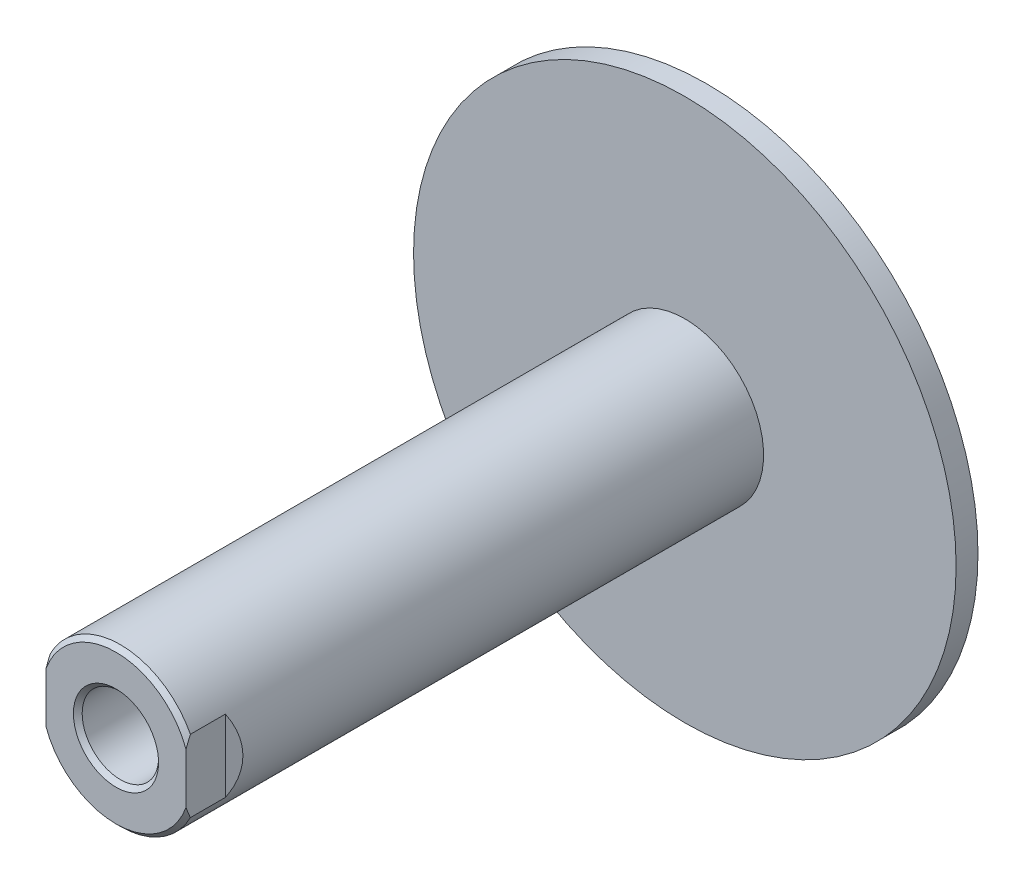
ISO-10303-21;
HEADER;
FILE_DESCRIPTION(('STEP AP214'),'2;1');
FILE_NAME('part.step','',(''),(''),'','','');
FILE_SCHEMA(('AUTOMOTIVE_DESIGN { 1 0 10303 214 1 1 1 1 }'));
ENDSEC;
DATA;
#1=APPLICATION_CONTEXT('core data for automotive mechanical design processes');
#2=APPLICATION_PROTOCOL_DEFINITION('international standard','automotive_design',2000,#1);
#3=PRODUCT_CONTEXT('',#1,'mechanical');
#4=PRODUCT('Part','Part','',(#3));
#5=PRODUCT_RELATED_PRODUCT_CATEGORY('part','',(#4));
#6=PRODUCT_DEFINITION_FORMATION('','',#4);
#7=PRODUCT_DEFINITION_CONTEXT('part definition',#1,'design');
#8=PRODUCT_DEFINITION('design','',#6,#7);
#9=PRODUCT_DEFINITION_SHAPE('','',#8);
#10=(LENGTH_UNIT() NAMED_UNIT(*) SI_UNIT(.MILLI.,.METRE.));
#11=(NAMED_UNIT(*) PLANE_ANGLE_UNIT() SI_UNIT($,.RADIAN.));
#12=(NAMED_UNIT(*) SI_UNIT($,.STERADIAN.) SOLID_ANGLE_UNIT());
#13=UNCERTAINTY_MEASURE_WITH_UNIT(LENGTH_MEASURE(1.E-05),#10,'distance_accuracy_value','');
#14=(GEOMETRIC_REPRESENTATION_CONTEXT(3) GLOBAL_UNCERTAINTY_ASSIGNED_CONTEXT((#13)) GLOBAL_UNIT_ASSIGNED_CONTEXT((#10,
#11,#12)) REPRESENTATION_CONTEXT('',''));
#15=CARTESIAN_POINT('',(0.,0.,0.));
#16=DIRECTION('',(0.,0.,1.));
#17=DIRECTION('',(1.,0.,0.));
#18=AXIS2_PLACEMENT_3D('',#15,#16,#17);
#19=CARTESIAN_POINT('',(0.,0.,5.));
#20=DIRECTION('',(0.,0.,-1.));
#21=DIRECTION('',(-1.,0.,0.));
#22=AXIS2_PLACEMENT_3D('',#19,#20,#21);
#23=CYLINDRICAL_SURFACE('',#22,18.);
#24=CARTESIAN_POINT('',(0.,0.,134.));
#25=DIRECTION('',(0.,0.,-1.));
#26=DIRECTION('',(-1.,0.,0.));
#27=AXIS2_PLACEMENT_3D('',#24,#25,#26);
#28=CIRCLE('',#27,18.);
#29=CARTESIAN_POINT('',(16.,-8.24621125123532,134.));
#30=VERTEX_POINT('',#29);
#31=CARTESIAN_POINT('',(-16.,-8.24621125123534,134.));
#32=VERTEX_POINT('',#31);
#33=EDGE_CURVE('E136',#30,#32,#28,.T.);
#34=ORIENTED_EDGE('',*,*,#33,.T.);
#35=DIRECTION('',(0.,0.,-1.));
#36=VECTOR('',#35,1.);
#37=CARTESIAN_POINT('',(-16.,-8.24621125123532,5.));
#38=LINE('',#37,#36);
#39=CARTESIAN_POINT('',(-16.,-8.24621125123532,126.));
#40=VERTEX_POINT('',#39);
#41=EDGE_CURVE('E120',#32,#40,#38,.T.);
#42=ORIENTED_EDGE('',*,*,#41,.T.);
#43=CARTESIAN_POINT('',(0.,0.,142.));
#44=DIRECTION('',(-0.707106781186552,0.,0.707106781186543));
#45=DIRECTION('',(-0.707106781186543,0.,-0.707106781186552));
#46=AXIS2_PLACEMENT_3D('',#43,#44,#45);
#47=ELLIPSE('',#46,25.4558441227159,18.);
#48=CARTESIAN_POINT('',(-18.,0.,124.));
#49=VERTEX_POINT('',#48);
#50=EDGE_CURVE('E48',#40,#49,#47,.F.);
#51=ORIENTED_EDGE('',*,*,#50,.T.);
#52=CARTESIAN_POINT('',(0.,0.,142.));
#53=DIRECTION('',(-0.707106781186552,0.,0.707106781186543));
#54=DIRECTION('',(-0.707106781186543,0.,-0.707106781186552));
#55=AXIS2_PLACEMENT_3D('',#52,#53,#54);
#56=ELLIPSE('',#55,25.4558441227159,18.);
#57=CARTESIAN_POINT('',(-16.,8.24621125123532,126.));
#58=VERTEX_POINT('',#57);
#59=EDGE_CURVE('E201',#49,#58,#56,.F.);
#60=ORIENTED_EDGE('',*,*,#59,.T.);
#61=DIRECTION('',(0.,0.,-1.));
#62=VECTOR('',#61,1.);
#63=CARTESIAN_POINT('',(-16.,8.24621125123532,5.));
#64=LINE('',#63,#62);
#65=CARTESIAN_POINT('',(-16.,8.24621125123532,134.));
#66=VERTEX_POINT('',#65);
#67=EDGE_CURVE('E118',#58,#66,#64,.F.);
#68=ORIENTED_EDGE('',*,*,#67,.T.);
#69=CARTESIAN_POINT('',(16.,8.24621125123534,134.));
#70=VERTEX_POINT('',#69);
#71=EDGE_CURVE('E133',#66,#70,#28,.T.);
#72=ORIENTED_EDGE('',*,*,#71,.T.);
#73=DIRECTION('',(0.,0.,-1.));
#74=VECTOR('',#73,1.);
#75=CARTESIAN_POINT('',(16.,8.24621125123532,5.));
#76=LINE('',#75,#74);
#77=CARTESIAN_POINT('',(16.,8.24621125123532,126.));
#78=VERTEX_POINT('',#77);
#79=EDGE_CURVE('E127',#70,#78,#76,.T.);
#80=ORIENTED_EDGE('',*,*,#79,.T.);
#81=CARTESIAN_POINT('',(0.,0.,142.));
#82=DIRECTION('',(-0.707106781186552,0.,-0.707106781186543));
#83=DIRECTION('',(0.707106781186543,0.,-0.707106781186552));
#84=AXIS2_PLACEMENT_3D('',#81,#82,#83);
#85=ELLIPSE('',#84,25.4558441227159,18.);
#86=CARTESIAN_POINT('',(18.,0.,124.));
#87=VERTEX_POINT('',#86);
#88=EDGE_CURVE('E55',#78,#87,#85,.T.);
#89=ORIENTED_EDGE('',*,*,#88,.T.);
#90=CARTESIAN_POINT('',(0.,0.,142.));
#91=DIRECTION('',(-0.707106781186552,0.,-0.707106781186543));
#92=DIRECTION('',(0.707106781186543,0.,-0.707106781186552));
#93=AXIS2_PLACEMENT_3D('',#90,#91,#92);
#94=ELLIPSE('',#93,25.4558441227159,18.);
#95=CARTESIAN_POINT('',(16.,-8.24621125123532,126.));
#96=VERTEX_POINT('',#95);
#97=EDGE_CURVE('E206',#87,#96,#94,.T.);
#98=ORIENTED_EDGE('',*,*,#97,.T.);
#99=DIRECTION('',(0.,0.,-1.));
#100=VECTOR('',#99,1.);
#101=CARTESIAN_POINT('',(16.,-8.24621125123532,5.));
#102=LINE('',#101,#100);
#103=EDGE_CURVE('E125',#96,#30,#102,.F.);
#104=ORIENTED_EDGE('',*,*,#103,.T.);
#105=EDGE_LOOP('',(#34,#42,#51,#60,#68,#72,#80,#89,#98,#104));
#106=FACE_BOUND('',#105,.T.);
#107=CARTESIAN_POINT('',(0.,0.,5.));
#108=DIRECTION('',(0.,0.,-1.));
#109=DIRECTION('',(-1.,0.,0.));
#110=AXIS2_PLACEMENT_3D('',#107,#108,#109);
#111=CIRCLE('',#110,18.);
#112=CARTESIAN_POINT('',(-18.,0.,5.));
#113=VERTEX_POINT('',#112);
#114=EDGE_CURVE('E197',#113,#113,#111,.T.);
#115=ORIENTED_EDGE('',*,*,#114,.F.);
#116=EDGE_LOOP('',(#115));
#117=FACE_BOUND('',#116,.T.);
#118=ADVANCED_FACE('F33',(#106,#117),#23,.T.);
#119=CARTESIAN_POINT('',(0.,0.,134.));
#120=DIRECTION('',(0.,0.,-1.));
#121=DIRECTION('',(-1.,0.,0.));
#122=AXIS2_PLACEMENT_3D('',#119,#120,#121);
#123=CONICAL_SURFACE('',#122,18.,0.785398163397457);
#124=CARTESIAN_POINT('',(-16.,-32.2604138859753,115.989802776236));
#125=CARTESIAN_POINT('',(-16.,-31.7901677461984,116.411067381633));
#126=CARTESIAN_POINT('',(-16.,-31.3190300930379,116.831339806205));
#127=CARTESIAN_POINT('',(-16.,-30.3747207646579,117.669603402482));
#128=CARTESIAN_POINT('',(-16.,-29.9015490669143,118.087594548807));
#129=CARTESIAN_POINT('',(-16.,-28.9527730456965,118.921128172956));
#130=CARTESIAN_POINT('',(-16.,-28.4771679642071,119.336669788481));
#131=CARTESIAN_POINT('',(-16.,-27.5233846790694,120.164788395817));
#132=CARTESIAN_POINT('',(-16.,-27.0452064822468,120.577365395487));
#133=CARTESIAN_POINT('',(-16.,-26.0807206335586,121.403572014866));
#134=CARTESIAN_POINT('',(-16.,-25.5943810863074,121.81716442667));
#135=CARTESIAN_POINT('',(-16.,-24.6182937723538,122.640306936554));
#136=CARTESIAN_POINT('',(-16.,-24.1285460199006,123.049857051517));
#137=CARTESIAN_POINT('',(-16.,-23.145221067874,123.86416345551));
#138=CARTESIAN_POINT('',(-16.,-22.6516445488629,124.268920565581));
#139=CARTESIAN_POINT('',(-16.,-21.6599770353412,125.072870467958));
#140=CARTESIAN_POINT('',(-16.,-21.161886055188,125.47206327795));
#141=CARTESIAN_POINT('',(-16.,-20.1970202809795,126.234929242798));
#142=CARTESIAN_POINT('',(-16.,-19.730613952764,126.599067912721));
#143=CARTESIAN_POINT('',(-16.,-18.7926075210136,127.320610675404));
#144=CARTESIAN_POINT('',(-16.,-18.3210073843597,127.678014725179));
#145=CARTESIAN_POINT('',(-16.,-17.3715498224993,128.384957416353));
#146=CARTESIAN_POINT('',(-16.,-16.8936892295689,128.734491811831));
#147=CARTESIAN_POINT('',(-16.,-15.9309919811247,129.423827409837));
#148=CARTESIAN_POINT('',(-16.,-15.4461554324841,129.763628761238));
#149=CARTESIAN_POINT('',(-16.,-14.4694487739771,130.43062533045));
#150=CARTESIAN_POINT('',(-16.,-13.9775967910219,130.757847007549));
#151=CARTESIAN_POINT('',(-16.,-12.9844451694027,131.397778141565));
#152=CARTESIAN_POINT('',(-16.,-12.4831447638614,131.710486413315));
#153=CARTESIAN_POINT('',(-16.,-11.4701011769342,132.317548523186));
#154=CARTESIAN_POINT('',(-16.,-10.9583676873323,132.611918450053));
#155=CARTESIAN_POINT('',(-16.,-9.9225662464619,133.177959828913));
#156=CARTESIAN_POINT('',(-16.,-9.39850132668658,133.449636786428));
#157=CARTESIAN_POINT('',(-16.,-8.37306725262328,133.946707563565));
#158=CARTESIAN_POINT('',(-16.,-7.87262630911151,134.174001314217));
#159=CARTESIAN_POINT('',(-16.,-6.85881486516804,134.597950782948));
#160=CARTESIAN_POINT('',(-16.,-6.34544427733388,134.794606293853));
#161=CARTESIAN_POINT('',(-16.,-5.30788822023104,135.149554998693));
#162=CARTESIAN_POINT('',(-16.,-4.78376065058801,135.308014075351));
#163=CARTESIAN_POINT('',(-16.,-3.98901485379093,135.512229186905));
#164=CARTESIAN_POINT('',(-16.,-3.72264358028348,135.574727090265));
#165=CARTESIAN_POINT('',(-16.,-3.18737716446325,135.687704480158));
#166=CARTESIAN_POINT('',(-16.,-2.91848235445183,135.738185526624));
#167=CARTESIAN_POINT('',(-16.,-2.37391676304056,135.827119049705));
#168=CARTESIAN_POINT('',(-16.,-2.09820931390715,135.865347894212));
#169=CARTESIAN_POINT('',(-16.,-1.54521403603758,135.927905394783));
#170=CARTESIAN_POINT('',(-16.,-1.26792621184321,135.952234090773));
#171=CARTESIAN_POINT('',(-16.,-0.712495051003861,135.986542158926));
#172=CARTESIAN_POINT('',(-16.,-0.434351827733465,135.996523356965));
#173=CARTESIAN_POINT('',(-16.,0.122077459136425,136.001953003038));
#174=CARTESIAN_POINT('',(-16.,0.400363522874352,135.997401436961));
#175=CARTESIAN_POINT('',(-16.,0.956718848818026,135.973835358758));
#176=CARTESIAN_POINT('',(-16.,1.23478722930014,135.954800136423));
#177=CARTESIAN_POINT('',(-16.,1.78958630370361,135.902598300121));
#178=CARTESIAN_POINT('',(-16.,2.06631700074498,135.869431719129));
#179=CARTESIAN_POINT('',(-16.,2.61785285402907,135.789550251203));
#180=CARTESIAN_POINT('',(-16.,2.89265769141185,135.742833172597));
#181=CARTESIAN_POINT('',(-16.,3.43981771135313,135.636617403483));
#182=CARTESIAN_POINT('',(-16.,3.71217247809239,135.577116584456));
#183=CARTESIAN_POINT('',(-16.,4.31909359443356,135.430501698515));
#184=CARTESIAN_POINT('',(-16.,4.65288775323948,135.340187914066));
#185=CARTESIAN_POINT('',(-16.,5.31562098521111,135.143082435755));
#186=CARTESIAN_POINT('',(-16.,5.64455891135976,135.036286915118));
#187=CARTESIAN_POINT('',(-16.,6.29739538439554,134.808036071774));
#188=CARTESIAN_POINT('',(-16.,6.62129238827354,134.686576356305));
#189=CARTESIAN_POINT('',(-16.,7.26390042295628,134.430783557165));
#190=CARTESIAN_POINT('',(-16.,7.58261197970081,134.296451788698));
#191=CARTESIAN_POINT('',(-16.,8.21874361337546,134.014854942071));
#192=CARTESIAN_POINT('',(-16.,8.53610431791043,133.867456226404));
#193=CARTESIAN_POINT('',(-16.,9.16593288928629,133.562581765366));
#194=CARTESIAN_POINT('',(-16.,9.47840073399939,133.405105974438));
#195=CARTESIAN_POINT('',(-16.,10.0986407344004,133.08142240998));
#196=CARTESIAN_POINT('',(-16.,10.4064143657966,132.915217456801));
#197=CARTESIAN_POINT('',(-16.,11.017682985241,132.575148069501));
#198=CARTESIAN_POINT('',(-16.,11.321178018978,132.401283717251));
#199=CARTESIAN_POINT('',(-16.,12.1136356553263,131.935548806207));
#200=CARTESIAN_POINT('',(-16.,12.5993531442477,131.638152571687));
#201=CARTESIAN_POINT('',(-16.,13.5617402718639,131.02901775578));
#202=CARTESIAN_POINT('',(-16.,14.0384087594318,130.717277366711));
#203=CARTESIAN_POINT('',(-16.,14.984097895908,130.081959994748));
#204=CARTESIAN_POINT('',(-16.,15.4531148198882,129.75837748167));
#205=CARTESIAN_POINT('',(-16.,16.3843179170124,129.101594568935));
#206=CARTESIAN_POINT('',(-16.,16.8465043685515,128.768394562908));
#207=CARTESIAN_POINT('',(-16.,17.7661917106301,128.093099634279));
#208=CARTESIAN_POINT('',(-16.,18.2236770993838,127.750983640965));
#209=CARTESIAN_POINT('',(-16.,19.1335144584455,127.059995621801));
#210=CARTESIAN_POINT('',(-16.,19.5858663844701,126.711123537741));
#211=CARTESIAN_POINT('',(-16.,20.4859837924916,126.007757357872));
#212=CARTESIAN_POINT('',(-16.,20.9337504316948,125.653264741116));
#213=CARTESIAN_POINT('',(-16.,21.8253809784867,124.939401315363));
#214=CARTESIAN_POINT('',(-16.,22.2692448419054,124.580030451273));
#215=CARTESIAN_POINT('',(-16.,23.5271645562885,123.551693380703));
#216=CARTESIAN_POINT('',(-16.,24.3371177236189,122.877707150414));
#217=CARTESIAN_POINT('',(-16.,25.9478528114657,121.518784046039));
#218=CARTESIAN_POINT('',(-16.,26.7486340723279,120.833846392696));
#219=CARTESIAN_POINT('',(-16.,28.3380122061533,119.459493105724));
#220=CARTESIAN_POINT('',(-16.,29.1266532573266,118.770128511501));
#221=CARTESIAN_POINT('',(-16.,30.3050578938743,117.731029354981));
#222=CARTESIAN_POINT('',(-16.,30.6970744456541,117.383843809649));
#223=CARTESIAN_POINT('',(-16.,31.4797376349422,116.687936132175));
#224=CARTESIAN_POINT('',(-16.,31.8703842799375,116.339214008455));
#225=CARTESIAN_POINT('',(-16.,32.2604138859753,115.989802776236));
#226=B_SPLINE_CURVE_WITH_KNOTS('',3,(#124,#125,#126,#127,#128,#129,#130,#131,#132,#133,#134,
#135,#136,#137,#138,#139,#140,#141,#142,#143,#144,#145,#146,#147,#148,#149,#150,#151,#152,#153,
#154,#155,#156,#157,#158,#159,#160,#161,#162,#163,#164,#165,#166,#167,#168,#169,#170,#171,#172,
#173,#174,#175,#176,#177,#178,#179,#180,#181,#182,#183,#184,#185,#186,#187,#188,#189,#190,#191,
#192,#193,#194,#195,#196,#197,#198,#199,#200,#201,#202,#203,#204,#205,#206,#207,#208,#209,#210,
#211,#212,#213,#214,#215,#216,#217,#218,#219,#220,#221,#222,#223,#224,#225),.UNSPECIFIED.,.F.,
.F.,(4,2,2,2,2,2,2,2,2,2,2,2,2,2,2,2,2,2,2,2,2,2,2,2,2,2,2,2,2,2,2,2,2,2,2,2,2,2,2,2,2,2,2,2,2,
2,2,2,2,2,4),(0.,1.89403368185118,3.78808839177536,5.68277419797062,7.57745498066303,
9.4927072509908,11.4079515188108,13.3228628162303,15.2377680257826,17.0128749537557,
18.7879932075075,20.5640472906544,22.3400741931897,24.1121345646727,25.8843393894076,
27.6549668528158,29.42516349067,31.0732470467876,32.7213417466939,34.3621445227151,
35.1827294674414,36.0032078320883,36.8379060439637,37.6726018582344,38.5071914388842,
39.3417818299079,40.1775678513109,41.0133519223819,41.8492712493799,42.685329866647,
43.7222295157082,44.7593702782867,45.7968224981738,46.8341688289667,47.8837270428243,
48.933290001902,49.982515913706,51.0317306128909,52.7399870007145,54.4484592596593,
56.1577398065094,57.8669504936109,59.5806520480974,61.2943683744211,63.0076409814115,
64.7209329535513,67.8818890793591,71.0430711350671,74.1854074047582,75.7563699519116,
77.3273238997227),.UNSPECIFIED.);
#227=CARTESIAN_POINT('',(-16.,-5.74456264653797,135.));
#228=VERTEX_POINT('',#227);
#229=EDGE_CURVE('E212',#32,#228,#226,.T.);
#230=ORIENTED_EDGE('',*,*,#229,.F.);
#231=ORIENTED_EDGE('',*,*,#33,.F.);
#232=CARTESIAN_POINT('',(16.,32.2604138859753,115.989802776236));
#233=CARTESIAN_POINT('',(16.,31.7901677461984,116.411067381633));
#234=CARTESIAN_POINT('',(16.,31.3190300930379,116.831339806205));
#235=CARTESIAN_POINT('',(16.,30.3747207646579,117.669603402482));
#236=CARTESIAN_POINT('',(16.,29.9015490669143,118.087594548807));
#237=CARTESIAN_POINT('',(16.,28.9527730456965,118.921128172956));
#238=CARTESIAN_POINT('',(16.,28.4771679642071,119.336669788481));
#239=CARTESIAN_POINT('',(16.,27.5233846790694,120.164788395817));
#240=CARTESIAN_POINT('',(16.,27.0452064822468,120.577365395487));
#241=CARTESIAN_POINT('',(16.,26.0807206335586,121.403572014866));
#242=CARTESIAN_POINT('',(16.,25.5943810863074,121.81716442667));
#243=CARTESIAN_POINT('',(16.,24.6182937723538,122.640306936554));
#244=CARTESIAN_POINT('',(16.,24.1285460199006,123.049857051517));
#245=CARTESIAN_POINT('',(16.,23.145221067874,123.86416345551));
#246=CARTESIAN_POINT('',(16.,22.6516445488629,124.268920565581));
#247=CARTESIAN_POINT('',(16.,21.6599770353412,125.072870467958));
#248=CARTESIAN_POINT('',(16.,21.161886055188,125.47206327795));
#249=CARTESIAN_POINT('',(16.,20.1970202809795,126.234929242798));
#250=CARTESIAN_POINT('',(16.,19.730613952764,126.599067912721));
#251=CARTESIAN_POINT('',(16.,18.7926075210136,127.320610675404));
#252=CARTESIAN_POINT('',(16.,18.3210073843597,127.678014725179));
#253=CARTESIAN_POINT('',(16.,17.3715498224993,128.384957416353));
#254=CARTESIAN_POINT('',(16.,16.8936892295689,128.734491811831));
#255=CARTESIAN_POINT('',(16.,15.9309919811247,129.423827409837));
#256=CARTESIAN_POINT('',(16.,15.4461554324841,129.763628761238));
#257=CARTESIAN_POINT('',(16.,14.4694487739771,130.43062533045));
#258=CARTESIAN_POINT('',(16.,13.9775967910219,130.757847007549));
#259=CARTESIAN_POINT('',(16.,12.9844451694027,131.397778141565));
#260=CARTESIAN_POINT('',(16.,12.4831447638614,131.710486413315));
#261=CARTESIAN_POINT('',(16.,11.4701011769342,132.317548523186));
#262=CARTESIAN_POINT('',(16.,10.9583676873323,132.611918450053));
#263=CARTESIAN_POINT('',(16.,9.9225662464619,133.177959828913));
#264=CARTESIAN_POINT('',(16.,9.39850132668658,133.449636786428));
#265=CARTESIAN_POINT('',(16.,8.37306725262328,133.946707563565));
#266=CARTESIAN_POINT('',(16.,7.87262630911151,134.174001314217));
#267=CARTESIAN_POINT('',(16.,6.85881486516804,134.597950782948));
#268=CARTESIAN_POINT('',(16.,6.34544427733388,134.794606293853));
#269=CARTESIAN_POINT('',(16.,5.30788822023104,135.149554998693));
#270=CARTESIAN_POINT('',(16.,4.78376065058801,135.308014075351));
#271=CARTESIAN_POINT('',(16.,3.98901485379093,135.512229186905));
#272=CARTESIAN_POINT('',(16.,3.72264358028348,135.574727090265));
#273=CARTESIAN_POINT('',(16.,3.18737716446325,135.687704480158));
#274=CARTESIAN_POINT('',(16.,2.91848235445183,135.738185526624));
#275=CARTESIAN_POINT('',(16.,2.37391676304056,135.827119049705));
#276=CARTESIAN_POINT('',(16.,2.09820931390715,135.865347894212));
#277=CARTESIAN_POINT('',(16.,1.54521403603758,135.927905394783));
#278=CARTESIAN_POINT('',(16.,1.26792621184321,135.952234090773));
#279=CARTESIAN_POINT('',(16.,0.712495051003861,135.986542158926));
#280=CARTESIAN_POINT('',(16.,0.434351827733465,135.996523356965));
#281=CARTESIAN_POINT('',(16.,-0.122077459136425,136.001953003038));
#282=CARTESIAN_POINT('',(16.,-0.400363522874352,135.997401436961));
#283=CARTESIAN_POINT('',(16.,-0.956718848818026,135.973835358758));
#284=CARTESIAN_POINT('',(16.,-1.23478722930014,135.954800136423));
#285=CARTESIAN_POINT('',(16.,-1.78958630370361,135.902598300121));
#286=CARTESIAN_POINT('',(16.,-2.06631700074498,135.869431719129));
#287=CARTESIAN_POINT('',(16.,-2.61785285402907,135.789550251203));
#288=CARTESIAN_POINT('',(16.,-2.89265769141185,135.742833172597));
#289=CARTESIAN_POINT('',(16.,-3.43981771135313,135.636617403483));
#290=CARTESIAN_POINT('',(16.,-3.71217247809239,135.577116584456));
#291=CARTESIAN_POINT('',(16.,-4.31909359443356,135.430501698515));
#292=CARTESIAN_POINT('',(16.,-4.65288775323948,135.340187914066));
#293=CARTESIAN_POINT('',(16.,-5.31562098521111,135.143082435755));
#294=CARTESIAN_POINT('',(16.,-5.64455891135976,135.036286915118));
#295=CARTESIAN_POINT('',(16.,-6.29739538439554,134.808036071774));
#296=CARTESIAN_POINT('',(16.,-6.62129238827354,134.686576356305));
#297=CARTESIAN_POINT('',(16.,-7.26390042295628,134.430783557165));
#298=CARTESIAN_POINT('',(16.,-7.58261197970081,134.296451788698));
#299=CARTESIAN_POINT('',(16.,-8.21874361337546,134.014854942071));
#300=CARTESIAN_POINT('',(16.,-8.53610431791043,133.867456226404));
#301=CARTESIAN_POINT('',(16.,-9.16593288928629,133.562581765366));
#302=CARTESIAN_POINT('',(16.,-9.47840073399939,133.405105974438));
#303=CARTESIAN_POINT('',(16.,-10.0986407344004,133.08142240998));
#304=CARTESIAN_POINT('',(16.,-10.4064143657966,132.915217456801));
#305=CARTESIAN_POINT('',(16.,-11.017682985241,132.575148069501));
#306=CARTESIAN_POINT('',(16.,-11.321178018978,132.401283717251));
#307=CARTESIAN_POINT('',(16.,-12.1136356553263,131.935548806207));
#308=CARTESIAN_POINT('',(16.,-12.5993531442477,131.638152571687));
#309=CARTESIAN_POINT('',(16.,-13.5617402718639,131.02901775578));
#310=CARTESIAN_POINT('',(16.,-14.0384087594318,130.717277366711));
#311=CARTESIAN_POINT('',(16.,-14.984097895908,130.081959994748));
#312=CARTESIAN_POINT('',(16.,-15.4531148198882,129.75837748167));
#313=CARTESIAN_POINT('',(16.,-16.3843179170124,129.101594568935));
#314=CARTESIAN_POINT('',(16.,-16.8465043685515,128.768394562908));
#315=CARTESIAN_POINT('',(16.,-17.7661917106301,128.093099634279));
#316=CARTESIAN_POINT('',(16.,-18.2236770993838,127.750983640965));
#317=CARTESIAN_POINT('',(16.,-19.1335144584455,127.059995621801));
#318=CARTESIAN_POINT('',(16.,-19.5858663844701,126.711123537741));
#319=CARTESIAN_POINT('',(16.,-20.4859837924916,126.007757357872));
#320=CARTESIAN_POINT('',(16.,-20.9337504316948,125.653264741116));
#321=CARTESIAN_POINT('',(16.,-21.8253809784867,124.939401315363));
#322=CARTESIAN_POINT('',(16.,-22.2692448419054,124.580030451273));
#323=CARTESIAN_POINT('',(16.,-23.5271645562885,123.551693380703));
#324=CARTESIAN_POINT('',(16.,-24.3371177236189,122.877707150414));
#325=CARTESIAN_POINT('',(16.,-25.9478528114657,121.518784046039));
#326=CARTESIAN_POINT('',(16.,-26.7486340723279,120.833846392696));
#327=CARTESIAN_POINT('',(16.,-28.3380122061533,119.459493105724));
#328=CARTESIAN_POINT('',(16.,-29.1266532573266,118.770128511501));
#329=CARTESIAN_POINT('',(16.,-30.3050578938743,117.731029354981));
#330=CARTESIAN_POINT('',(16.,-30.6970744456541,117.383843809649));
#331=CARTESIAN_POINT('',(16.,-31.4797376349422,116.687936132175));
#332=CARTESIAN_POINT('',(16.,-31.8703842799375,116.339214008455));
#333=CARTESIAN_POINT('',(16.,-32.2604138859753,115.989802776236));
#334=B_SPLINE_CURVE_WITH_KNOTS('',3,(#232,#233,#234,#235,#236,#237,#238,#239,#240,#241,#242,
#243,#244,#245,#246,#247,#248,#249,#250,#251,#252,#253,#254,#255,#256,#257,#258,#259,#260,#261,
#262,#263,#264,#265,#266,#267,#268,#269,#270,#271,#272,#273,#274,#275,#276,#277,#278,#279,#280,
#281,#282,#283,#284,#285,#286,#287,#288,#289,#290,#291,#292,#293,#294,#295,#296,#297,#298,#299,
#300,#301,#302,#303,#304,#305,#306,#307,#308,#309,#310,#311,#312,#313,#314,#315,#316,#317,#318,
#319,#320,#321,#322,#323,#324,#325,#326,#327,#328,#329,#330,#331,#332,#333),.UNSPECIFIED.,.F.,
.F.,(4,2,2,2,2,2,2,2,2,2,2,2,2,2,2,2,2,2,2,2,2,2,2,2,2,2,2,2,2,2,2,2,2,2,2,2,2,2,2,2,2,2,2,2,2,
2,2,2,2,2,4),(0.,1.89403368185118,3.78808839177536,5.68277419797062,7.57745498066303,
9.4927072509908,11.4079515188108,13.3228628162303,15.2377680257826,17.0128749537557,
18.7879932075075,20.5640472906544,22.3400741931897,24.1121345646727,25.8843393894076,
27.6549668528158,29.42516349067,31.0732470467876,32.7213417466939,34.3621445227151,
35.1827294674414,36.0032078320883,36.8379060439637,37.6726018582344,38.5071914388842,
39.3417818299079,40.1775678513109,41.0133519223819,41.8492712493799,42.685329866647,
43.7222295157082,44.7593702782867,45.7968224981738,46.8341688289667,47.8837270428243,
48.933290001902,49.982515913706,51.0317306128909,52.7399870007145,54.4484592596593,
56.1577398065094,57.8669504936109,59.5806520480974,61.2943683744211,63.0076409814115,
64.7209329535513,67.8818890793591,71.0430711350671,74.1854074047582,75.7563699519116,
77.3273238997227),.UNSPECIFIED.);
#335=CARTESIAN_POINT('',(16.,-5.74456264653797,135.));
#336=VERTEX_POINT('',#335);
#337=EDGE_CURVE('E143',#336,#30,#334,.T.);
#338=ORIENTED_EDGE('',*,*,#337,.F.);
#339=CARTESIAN_POINT('',(0.,0.,135.));
#340=DIRECTION('',(0.,0.,-1.));
#341=DIRECTION('',(-1.,0.,0.));
#342=AXIS2_PLACEMENT_3D('',#339,#340,#341);
#343=CIRCLE('',#342,17.);
#344=EDGE_CURVE('E139',#228,#336,#343,.F.);
#345=ORIENTED_EDGE('',*,*,#344,.F.);
#346=EDGE_LOOP('',(#230,#231,#338,#345));
#347=FACE_BOUND('',#346,.T.);
#348=ADVANCED_FACE('F175',(#347),#123,.T.);
#349=CARTESIAN_POINT('',(0.,0.,135.));
#350=DIRECTION('',(0.,0.,-1.));
#351=DIRECTION('',(-1.,0.,0.));
#352=AXIS2_PLACEMENT_3D('',#349,#350,#351);
#353=PLANE('',#352);
#354=CARTESIAN_POINT('',(0.,0.,135.));
#355=DIRECTION('',(0.,0.,-1.));
#356=DIRECTION('',(-1.,0.,0.));
#357=AXIS2_PLACEMENT_3D('',#354,#355,#356);
#358=CIRCLE('',#357,9.73124999999991);
#359=CARTESIAN_POINT('',(-9.73124999999991,0.,135.));
#360=VERTEX_POINT('',#359);
#361=EDGE_CURVE('E12',#360,#360,#358,.T.);
#362=ORIENTED_EDGE('',*,*,#361,.T.);
#363=EDGE_LOOP('',(#362));
#364=FACE_BOUND('',#363,.T.);
#365=CARTESIAN_POINT('',(16.,5.74456264653797,135.));
#366=VERTEX_POINT('',#365);
#367=CARTESIAN_POINT('',(-16.,5.74456264653797,135.));
#368=VERTEX_POINT('',#367);
#369=EDGE_CURVE('E140',#366,#368,#343,.F.);
#370=ORIENTED_EDGE('',*,*,#369,.T.);
#371=DIRECTION('',(0.,1.,0.));
#372=VECTOR('',#371,1.);
#373=CARTESIAN_POINT('',(-16.,15.,135.));
#374=LINE('',#373,#372);
#375=EDGE_CURVE('E116',#228,#368,#374,.T.);
#376=ORIENTED_EDGE('',*,*,#375,.F.);
#377=ORIENTED_EDGE('',*,*,#344,.T.);
#378=DIRECTION('',(0.,-1.,0.));
#379=VECTOR('',#378,1.);
#380=CARTESIAN_POINT('',(16.,15.,135.));
#381=LINE('',#380,#379);
#382=EDGE_CURVE('E122',#366,#336,#381,.T.);
#383=ORIENTED_EDGE('',*,*,#382,.F.);
#384=EDGE_LOOP('',(#370,#376,#377,#383));
#385=FACE_BOUND('',#384,.T.);
#386=ADVANCED_FACE('F172',(#364,#385),#353,.F.);
#387=EDGE_CURVE('E153',#368,#66,#226,.T.);
#388=ORIENTED_EDGE('',*,*,#387,.F.);
#389=ORIENTED_EDGE('',*,*,#369,.F.);
#390=EDGE_CURVE('E152',#70,#366,#334,.T.);
#391=ORIENTED_EDGE('',*,*,#390,.F.);
#392=ORIENTED_EDGE('',*,*,#71,.F.);
#393=EDGE_LOOP('',(#388,#389,#391,#392));
#394=FACE_BOUND('',#393,.T.);
#395=ADVANCED_FACE('F160',(#394),#123,.T.);
#396=CARTESIAN_POINT('',(16.,15.,124.));
#397=DIRECTION('',(-1.,0.,0.));
#398=DIRECTION('',(0.,0.,1.));
#399=AXIS2_PLACEMENT_3D('',#396,#397,#398);
#400=PLANE('',#399);
#401=ORIENTED_EDGE('',*,*,#103,.F.);
#402=DIRECTION('',(0.,1.,0.));
#403=VECTOR('',#402,1.);
#404=CARTESIAN_POINT('',(16.,15.,126.));
#405=LINE('',#404,#403);
#406=EDGE_CURVE('E210',#96,#78,#405,.T.);
#407=ORIENTED_EDGE('',*,*,#406,.T.);
#408=ORIENTED_EDGE('',*,*,#79,.F.);
#409=ORIENTED_EDGE('',*,*,#390,.T.);
#410=ORIENTED_EDGE('',*,*,#382,.T.);
#411=ORIENTED_EDGE('',*,*,#337,.T.);
#412=EDGE_LOOP('',(#401,#407,#408,#409,#410,#411));
#413=FACE_BOUND('',#412,.T.);
#414=ADVANCED_FACE('F164',(#413),#400,.F.);
#415=CARTESIAN_POINT('',(-16.,15.,124.));
#416=DIRECTION('',(1.,0.,0.));
#417=DIRECTION('',(0.,0.,-1.));
#418=AXIS2_PLACEMENT_3D('',#415,#416,#417);
#419=PLANE('',#418);
#420=ORIENTED_EDGE('',*,*,#67,.F.);
#421=DIRECTION('',(0.,-1.,0.));
#422=VECTOR('',#421,1.);
#423=CARTESIAN_POINT('',(-16.,-8.24621125123532,126.));
#424=LINE('',#423,#422);
#425=EDGE_CURVE('E208',#58,#40,#424,.T.);
#426=ORIENTED_EDGE('',*,*,#425,.T.);
#427=ORIENTED_EDGE('',*,*,#41,.F.);
#428=ORIENTED_EDGE('',*,*,#229,.T.);
#429=ORIENTED_EDGE('',*,*,#375,.T.);
#430=ORIENTED_EDGE('',*,*,#387,.T.);
#431=EDGE_LOOP('',(#420,#426,#427,#428,#429,#430));
#432=FACE_BOUND('',#431,.T.);
#433=ADVANCED_FACE('F168',(#432),#419,.F.);
#434=CARTESIAN_POINT('',(18.,15.,124.));
#435=DIRECTION('',(-0.707106781186552,0.,-0.707106781186543));
#436=DIRECTION('',(-0.707106781186543,0.,0.707106781186552));
#437=AXIS2_PLACEMENT_3D('',#434,#435,#436);
#438=PLANE('',#437);
#439=ORIENTED_EDGE('',*,*,#88,.F.);
#440=ORIENTED_EDGE('',*,*,#406,.F.);
#441=ORIENTED_EDGE('',*,*,#97,.F.);
#442=EDGE_LOOP('',(#439,#440,#441));
#443=FACE_BOUND('',#442,.T.);
#444=ADVANCED_FACE('F235',(#443),#438,.F.);
#445=CARTESIAN_POINT('',(-18.,15.,124.));
#446=DIRECTION('',(-0.707106781186552,0.,0.707106781186543));
#447=DIRECTION('',(0.707106781186543,0.,0.707106781186552));
#448=AXIS2_PLACEMENT_3D('',#445,#446,#447);
#449=PLANE('',#448);
#450=ORIENTED_EDGE('',*,*,#50,.F.);
#451=ORIENTED_EDGE('',*,*,#425,.F.);
#452=ORIENTED_EDGE('',*,*,#59,.F.);
#453=EDGE_LOOP('',(#450,#451,#452));
#454=FACE_BOUND('',#453,.T.);
#455=ADVANCED_FACE('F232',(#454),#449,.T.);
#456=CARTESIAN_POINT('',(0.,0.,5.));
#457=DIRECTION('',(0.,0.,-1.));
#458=DIRECTION('',(-1.,0.,0.));
#459=AXIS2_PLACEMENT_3D('',#456,#457,#458);
#460=CYLINDRICAL_SURFACE('',#459,62.);
#461=CARTESIAN_POINT('',(0.,0.,5.));
#462=DIRECTION('',(0.,0.,-1.));
#463=DIRECTION('',(-1.,0.,0.));
#464=AXIS2_PLACEMENT_3D('',#461,#462,#463);
#465=CIRCLE('',#464,62.);
#466=CARTESIAN_POINT('',(-62.,0.,5.));
#467=VERTEX_POINT('',#466);
#468=EDGE_CURVE('E108',#467,#467,#465,.T.);
#469=ORIENTED_EDGE('',*,*,#468,.T.);
#470=EDGE_LOOP('',(#469));
#471=FACE_BOUND('',#470,.T.);
#472=CARTESIAN_POINT('',(0.,0.,0.));
#473=DIRECTION('',(0.,0.,-1.));
#474=DIRECTION('',(-1.,0.,0.));
#475=AXIS2_PLACEMENT_3D('',#472,#473,#474);
#476=CIRCLE('',#475,62.);
#477=CARTESIAN_POINT('',(-62.,0.,0.));
#478=VERTEX_POINT('',#477);
#479=EDGE_CURVE('E105',#478,#478,#476,.T.);
#480=ORIENTED_EDGE('',*,*,#479,.F.);
#481=EDGE_LOOP('',(#480));
#482=FACE_BOUND('',#481,.T.);
#483=ADVANCED_FACE('F234',(#471,#482),#460,.T.);
#484=CARTESIAN_POINT('',(0.,0.,5.));
#485=DIRECTION('',(0.,0.,-1.));
#486=DIRECTION('',(-1.,0.,0.));
#487=AXIS2_PLACEMENT_3D('',#484,#485,#486);
#488=PLANE('',#487);
#489=ORIENTED_EDGE('',*,*,#114,.T.);
#490=EDGE_LOOP('',(#489));
#491=FACE_BOUND('',#490,.T.);
#492=ORIENTED_EDGE('',*,*,#468,.F.);
#493=EDGE_LOOP('',(#492));
#494=FACE_BOUND('',#493,.T.);
#495=ADVANCED_FACE('F240',(#491,#494),#488,.F.);
#496=CARTESIAN_POINT('',(0.,0.,0.));
#497=DIRECTION('',(0.,0.,-1.));
#498=DIRECTION('',(-1.,0.,0.));
#499=AXIS2_PLACEMENT_3D('',#496,#497,#498);
#500=PLANE('',#499);
#501=CARTESIAN_POINT('',(0.,0.,0.));
#502=DIRECTION('',(0.,0.,-1.));
#503=DIRECTION('',(-1.,0.,0.));
#504=AXIS2_PLACEMENT_3D('',#501,#502,#503);
#505=CIRCLE('',#504,18.);
#506=CARTESIAN_POINT('',(-18.,0.,0.));
#507=VERTEX_POINT('',#506);
#508=EDGE_CURVE('E102',#507,#507,#505,.T.);
#509=ORIENTED_EDGE('',*,*,#508,.F.);
#510=EDGE_LOOP('',(#509));
#511=FACE_BOUND('',#510,.T.);
#512=ORIENTED_EDGE('',*,*,#479,.T.);
#513=EDGE_LOOP('',(#512));
#514=FACE_BOUND('',#513,.T.);
#515=ADVANCED_FACE('F316',(#511,#514),#500,.T.);
#516=CARTESIAN_POINT('',(0.,0.,5.));
#517=DIRECTION('',(0.,0.,-1.));
#518=DIRECTION('',(-1.,0.,0.));
#519=AXIS2_PLACEMENT_3D('',#516,#517,#518);
#520=CYLINDRICAL_SURFACE('',#519,18.);
#521=CARTESIAN_POINT('',(0.,0.,1.));
#522=DIRECTION('',(0.,0.,-1.));
#523=DIRECTION('',(-1.,0.,0.));
#524=AXIS2_PLACEMENT_3D('',#521,#522,#523);
#525=CIRCLE('',#524,18.);
#526=CARTESIAN_POINT('',(-18.,0.,1.));
#527=VERTEX_POINT('',#526);
#528=EDGE_CURVE('E111',#527,#527,#525,.T.);
#529=ORIENTED_EDGE('',*,*,#528,.F.);
#530=EDGE_LOOP('',(#529));
#531=FACE_BOUND('',#530,.T.);
#532=ORIENTED_EDGE('',*,*,#508,.T.);
#533=EDGE_LOOP('',(#532));
#534=FACE_BOUND('',#533,.T.);
#535=ADVANCED_FACE('F186',(#531,#534),#520,.F.);
#536=CARTESIAN_POINT('',(0.,0.,0.));
#537=DIRECTION('',(0.,0.,1.));
#538=DIRECTION('',(1.,0.,0.));
#539=AXIS2_PLACEMENT_3D('',#536,#537,#538);
#540=PLANE('',#539);
#541=CARTESIAN_POINT('',(0.,0.,0.));
#542=DIRECTION('',(0.,0.,-1.));
#543=DIRECTION('',(-1.,0.,0.));
#544=AXIS2_PLACEMENT_3D('',#541,#542,#543);
#545=CIRCLE('',#544,17.);
#546=CARTESIAN_POINT('',(-17.,0.,0.));
#547=VERTEX_POINT('',#546);
#548=EDGE_CURVE('E129',#547,#547,#545,.T.);
#549=ORIENTED_EDGE('',*,*,#548,.T.);
#550=EDGE_LOOP('',(#549));
#551=FACE_BOUND('',#550,.T.);
#552=ADVANCED_FACE('F180',(#551),#540,.F.);
#553=CARTESIAN_POINT('',(0.,0.,1.));
#554=DIRECTION('',(0.,0.,-1.));
#555=DIRECTION('',(-1.,0.,0.));
#556=AXIS2_PLACEMENT_3D('',#553,#554,#555);
#557=CYLINDRICAL_SURFACE('',#556,17.);
#558=CARTESIAN_POINT('',(0.,0.,1.));
#559=DIRECTION('',(0.,0.,-1.));
#560=DIRECTION('',(-1.,0.,0.));
#561=AXIS2_PLACEMENT_3D('',#558,#559,#560);
#562=CIRCLE('',#561,17.);
#563=CARTESIAN_POINT('',(-17.,0.,1.));
#564=VERTEX_POINT('',#563);
#565=EDGE_CURVE('E130',#564,#564,#562,.T.);
#566=ORIENTED_EDGE('',*,*,#565,.T.);
#567=EDGE_LOOP('',(#566));
#568=FACE_BOUND('',#567,.T.);
#569=ORIENTED_EDGE('',*,*,#548,.F.);
#570=EDGE_LOOP('',(#569));
#571=FACE_BOUND('',#570,.T.);
#572=ADVANCED_FACE('F177',(#568,#571),#557,.T.);
#573=CARTESIAN_POINT('',(0.,0.,1.));
#574=DIRECTION('',(0.,0.,-1.));
#575=DIRECTION('',(-1.,0.,0.));
#576=AXIS2_PLACEMENT_3D('',#573,#574,#575);
#577=PLANE('',#576);
#578=ORIENTED_EDGE('',*,*,#565,.F.);
#579=EDGE_LOOP('',(#578));
#580=FACE_BOUND('',#579,.T.);
#581=ORIENTED_EDGE('',*,*,#528,.T.);
#582=EDGE_LOOP('',(#581));
#583=FACE_BOUND('',#582,.T.);
#584=ADVANCED_FACE('F96',(#580,#583),#577,.T.);
#585=CARTESIAN_POINT('',(0.,0.,100.24));
#586=DIRECTION('',(0.,0.,1.));
#587=DIRECTION('',(1.,0.,0.));
#588=AXIS2_PLACEMENT_3D('',#585,#586,#587);
#589=CONICAL_SURFACE('',#588,8.73124999999999,1.02974425867665);
#590=CARTESIAN_POINT('',(0.,0.,94.9937357201156));
#591=VERTEX_POINT('',#590);
#592=VERTEX_LOOP('',#591);
#593=FACE_BOUND('',#592,.T.);
#594=CARTESIAN_POINT('',(0.,0.,100.24));
#595=DIRECTION('',(0.,0.,1.));
#596=DIRECTION('',(1.,0.,0.));
#597=AXIS2_PLACEMENT_3D('',#594,#595,#596);
#598=CIRCLE('',#597,8.73124999999999);
#599=CARTESIAN_POINT('',(8.73124999999999,0.,100.24));
#600=VERTEX_POINT('',#599);
#601=EDGE_CURVE('E100',#600,#600,#598,.T.);
#602=ORIENTED_EDGE('',*,*,#601,.T.);
#603=EDGE_LOOP('',(#602));
#604=FACE_BOUND('',#603,.T.);
#605=ADVANCED_FACE('F92',(#593,#604),#589,.F.);
#606=CARTESIAN_POINT('',(0.,0.,135.));
#607=DIRECTION('',(0.,0.,1.));
#608=DIRECTION('',(1.,0.,0.));
#609=AXIS2_PLACEMENT_3D('',#606,#607,#608);
#610=CYLINDRICAL_SURFACE('',#609,8.73124999999999);
#611=CARTESIAN_POINT('',(0.,0.,134.));
#612=DIRECTION('',(0.,0.,-1.));
#613=DIRECTION('',(-1.,0.,0.));
#614=AXIS2_PLACEMENT_3D('',#611,#612,#613);
#615=CIRCLE('',#614,8.73124999999999);
#616=CARTESIAN_POINT('',(-8.73124999999999,0.,134.));
#617=VERTEX_POINT('',#616);
#618=EDGE_CURVE('E41',#617,#617,#615,.F.);
#619=ORIENTED_EDGE('',*,*,#618,.T.);
#620=EDGE_LOOP('',(#619));
#621=FACE_BOUND('',#620,.T.);
#622=ORIENTED_EDGE('',*,*,#601,.F.);
#623=EDGE_LOOP('',(#622));
#624=FACE_BOUND('',#623,.T.);
#625=ADVANCED_FACE('F95',(#621,#624),#610,.F.);
#626=CARTESIAN_POINT('',(0.,0.,134.));
#627=DIRECTION('',(0.,0.,1.));
#628=DIRECTION('',(1.,0.,0.));
#629=AXIS2_PLACEMENT_3D('',#626,#627,#628);
#630=CONICAL_SURFACE('',#629,8.73124999999999,0.785398163397438);
#631=ORIENTED_EDGE('',*,*,#361,.F.);
#632=EDGE_LOOP('',(#631));
#633=FACE_BOUND('',#632,.T.);
#634=ORIENTED_EDGE('',*,*,#618,.F.);
#635=EDGE_LOOP('',(#634));
#636=FACE_BOUND('',#635,.T.);
#637=ADVANCED_FACE('F35',(#633,#636),#630,.F.);
#638=CLOSED_SHELL('',(#118,#348,#386,#395,#414,#433,#444,#455,#483,#495,#515,#535,#552,#572,
#584,#605,#625,#637));
#639=MANIFOLD_SOLID_BREP('B2',#638);
#640=ADVANCED_BREP_SHAPE_REPRESENTATION('',(#18,#639),#14);
#641=SHAPE_DEFINITION_REPRESENTATION(#9,#640);
ENDSEC;
END-ISO-10303-21;
